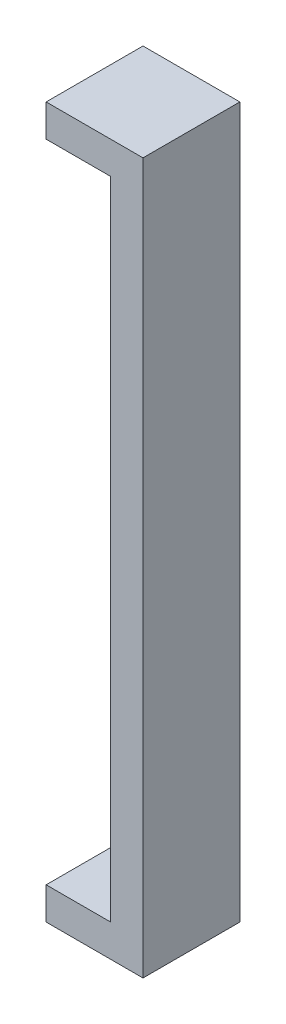
ISO-10303-21;
HEADER;
FILE_DESCRIPTION(('STEP AP214'),'2;1');
FILE_NAME('part.step','',(''),(''),'','','');
FILE_SCHEMA(('AUTOMOTIVE_DESIGN { 1 0 10303 214 1 1 1 1 }'));
ENDSEC;
DATA;
#1=APPLICATION_CONTEXT('core data for automotive mechanical design processes');
#2=APPLICATION_PROTOCOL_DEFINITION('international standard','automotive_design',2000,#1);
#3=PRODUCT_CONTEXT('',#1,'mechanical');
#4=PRODUCT('Part','Part','',(#3));
#5=PRODUCT_RELATED_PRODUCT_CATEGORY('part','',(#4));
#6=PRODUCT_DEFINITION_FORMATION('','',#4);
#7=PRODUCT_DEFINITION_CONTEXT('part definition',#1,'design');
#8=PRODUCT_DEFINITION('design','',#6,#7);
#9=PRODUCT_DEFINITION_SHAPE('','',#8);
#10=(LENGTH_UNIT() NAMED_UNIT(*) SI_UNIT(.MILLI.,.METRE.));
#11=(NAMED_UNIT(*) PLANE_ANGLE_UNIT() SI_UNIT($,.RADIAN.));
#12=(NAMED_UNIT(*) SI_UNIT($,.STERADIAN.) SOLID_ANGLE_UNIT());
#13=UNCERTAINTY_MEASURE_WITH_UNIT(LENGTH_MEASURE(1.E-05),#10,'distance_accuracy_value','');
#14=(GEOMETRIC_REPRESENTATION_CONTEXT(3) GLOBAL_UNCERTAINTY_ASSIGNED_CONTEXT((#13)) GLOBAL_UNIT_ASSIGNED_CONTEXT((#10,
#11,#12)) REPRESENTATION_CONTEXT('',''));
#15=CARTESIAN_POINT('',(0.,0.,0.));
#16=DIRECTION('',(0.,0.,1.));
#17=DIRECTION('',(1.,0.,0.));
#18=AXIS2_PLACEMENT_3D('',#15,#16,#17);
#19=CARTESIAN_POINT('',(2.94,33.,-3.20999999999999));
#20=DIRECTION('',(0.,0.,-1.));
#21=DIRECTION('',(-1.,0.,0.));
#22=AXIS2_PLACEMENT_3D('',#19,#20,#21);
#23=PLANE('',#22);
#24=DIRECTION('',(0.,-1.,0.));
#25=VECTOR('',#24,1.);
#26=CARTESIAN_POINT('',(-3.06,33.,-3.20999999999999));
#27=LINE('',#26,#25);
#28=CARTESIAN_POINT('',(-3.06,30.,-3.20999999999999));
#29=VERTEX_POINT('',#28);
#30=CARTESIAN_POINT('',(-3.06,-30.,-3.20999999999999));
#31=VERTEX_POINT('',#30);
#32=EDGE_CURVE('E11',#29,#31,#27,.T.);
#33=ORIENTED_EDGE('',*,*,#32,.T.);
#34=DIRECTION('',(1.,0.,0.));
#35=VECTOR('',#34,1.);
#36=CARTESIAN_POINT('',(-3.06,-30.,-3.20999999999999));
#37=LINE('',#36,#35);
#38=CARTESIAN_POINT('',(2.94,-30.,-3.20999999999999));
#39=VERTEX_POINT('',#38);
#40=EDGE_CURVE('E54',#31,#39,#37,.T.);
#41=ORIENTED_EDGE('',*,*,#40,.T.);
#42=DIRECTION('',(0.,-1.,0.));
#43=VECTOR('',#42,1.);
#44=CARTESIAN_POINT('',(2.94,33.,-3.20999999999999));
#45=LINE('',#44,#43);
#46=CARTESIAN_POINT('',(2.94,30.,-3.20999999999999));
#47=VERTEX_POINT('',#46);
#48=EDGE_CURVE('E48',#47,#39,#45,.T.);
#49=ORIENTED_EDGE('',*,*,#48,.F.);
#50=DIRECTION('',(1.,0.,0.));
#51=VECTOR('',#50,1.);
#52=CARTESIAN_POINT('',(-3.06,30.,-3.20999999999999));
#53=LINE('',#52,#51);
#54=EDGE_CURVE('E145',#29,#47,#53,.T.);
#55=ORIENTED_EDGE('',*,*,#54,.F.);
#56=EDGE_LOOP('',(#33,#41,#49,#55));
#57=FACE_BOUND('',#56,.T.);
#58=ADVANCED_FACE('F39',(#57),#23,.F.);
#59=CARTESIAN_POINT('',(2.94,33.,2.79000000000001));
#60=DIRECTION('',(1.,0.,0.));
#61=DIRECTION('',(0.,0.,-1.));
#62=AXIS2_PLACEMENT_3D('',#59,#60,#61);
#63=PLANE('',#62);
#64=ORIENTED_EDGE('',*,*,#48,.T.);
#65=DIRECTION('',(0.,0.,-1.));
#66=VECTOR('',#65,1.);
#67=CARTESIAN_POINT('',(2.94,-30.,2.79));
#68=LINE('',#67,#66);
#69=CARTESIAN_POINT('',(2.94,-30.,2.79000000000001));
#70=VERTEX_POINT('',#69);
#71=EDGE_CURVE('E141',#70,#39,#68,.T.);
#72=ORIENTED_EDGE('',*,*,#71,.F.);
#73=DIRECTION('',(0.,-1.,0.));
#74=VECTOR('',#73,1.);
#75=CARTESIAN_POINT('',(2.94,33.,2.79000000000001));
#76=LINE('',#75,#74);
#77=CARTESIAN_POINT('',(2.94,30.,2.79));
#78=VERTEX_POINT('',#77);
#79=EDGE_CURVE('E188',#78,#70,#76,.T.);
#80=ORIENTED_EDGE('',*,*,#79,.F.);
#81=DIRECTION('',(0.,0.,-1.));
#82=VECTOR('',#81,1.);
#83=CARTESIAN_POINT('',(2.94,30.,2.79));
#84=LINE('',#83,#82);
#85=EDGE_CURVE('E153',#78,#47,#84,.T.);
#86=ORIENTED_EDGE('',*,*,#85,.T.);
#87=EDGE_LOOP('',(#64,#72,#80,#86));
#88=FACE_BOUND('',#87,.T.);
#89=ADVANCED_FACE('F192',(#88),#63,.F.);
#90=CARTESIAN_POINT('',(-3.06,33.,-6.20999999999999));
#91=DIRECTION('',(1.,0.,0.));
#92=DIRECTION('',(0.,0.,-1.));
#93=AXIS2_PLACEMENT_3D('',#90,#91,#92);
#94=PLANE('',#93);
#95=DIRECTION('',(0.,0.,1.));
#96=VECTOR('',#95,1.);
#97=CARTESIAN_POINT('',(-3.06,-33.,-6.20999999999999));
#98=LINE('',#97,#96);
#99=CARTESIAN_POINT('',(-3.06,-33.,-6.20999999999999));
#100=VERTEX_POINT('',#99);
#101=CARTESIAN_POINT('',(-3.06,-33.,2.79));
#102=VERTEX_POINT('',#101);
#103=EDGE_CURVE('E108',#100,#102,#98,.T.);
#104=ORIENTED_EDGE('',*,*,#103,.T.);
#105=DIRECTION('',(0.,1.,0.));
#106=VECTOR('',#105,1.);
#107=CARTESIAN_POINT('',(-3.06,-33.,2.79));
#108=LINE('',#107,#106);
#109=CARTESIAN_POINT('',(-3.06,-30.,2.79));
#110=VERTEX_POINT('',#109);
#111=EDGE_CURVE('E119',#102,#110,#108,.T.);
#112=ORIENTED_EDGE('',*,*,#111,.T.);
#113=DIRECTION('',(0.,0.,-1.));
#114=VECTOR('',#113,1.);
#115=CARTESIAN_POINT('',(-3.06,-30.,2.79));
#116=LINE('',#115,#114);
#117=EDGE_CURVE('E135',#110,#31,#116,.T.);
#118=ORIENTED_EDGE('',*,*,#117,.T.);
#119=ORIENTED_EDGE('',*,*,#32,.F.);
#120=DIRECTION('',(0.,0.,-1.));
#121=VECTOR('',#120,1.);
#122=CARTESIAN_POINT('',(-3.06,30.,2.79));
#123=LINE('',#122,#121);
#124=CARTESIAN_POINT('',(-3.06,30.,2.79));
#125=VERTEX_POINT('',#124);
#126=EDGE_CURVE('E125',#125,#29,#123,.T.);
#127=ORIENTED_EDGE('',*,*,#126,.F.);
#128=DIRECTION('',(0.,-1.,0.));
#129=VECTOR('',#128,1.);
#130=CARTESIAN_POINT('',(-3.06,33.,2.79));
#131=LINE('',#130,#129);
#132=CARTESIAN_POINT('',(-3.06,33.,2.79));
#133=VERTEX_POINT('',#132);
#134=EDGE_CURVE('E146',#133,#125,#131,.T.);
#135=ORIENTED_EDGE('',*,*,#134,.F.);
#136=DIRECTION('',(0.,0.,1.));
#137=VECTOR('',#136,1.);
#138=CARTESIAN_POINT('',(-3.06,33.,-6.20999999999999));
#139=LINE('',#138,#137);
#140=CARTESIAN_POINT('',(-3.06,33.,-6.20999999999999));
#141=VERTEX_POINT('',#140);
#142=EDGE_CURVE('E161',#141,#133,#139,.T.);
#143=ORIENTED_EDGE('',*,*,#142,.F.);
#144=DIRECTION('',(0.,-1.,0.));
#145=VECTOR('',#144,1.);
#146=CARTESIAN_POINT('',(-3.06,33.,-6.20999999999999));
#147=LINE('',#146,#145);
#148=EDGE_CURVE('E123',#141,#100,#147,.T.);
#149=ORIENTED_EDGE('',*,*,#148,.T.);
#150=EDGE_LOOP('',(#104,#112,#118,#119,#127,#135,#143,#149));
#151=FACE_BOUND('',#150,.T.);
#152=ADVANCED_FACE('F41',(#151),#94,.F.);
#153=CARTESIAN_POINT('',(5.94,33.,2.79));
#154=DIRECTION('',(0.,0.,-1.));
#155=DIRECTION('',(-1.,0.,0.));
#156=AXIS2_PLACEMENT_3D('',#153,#154,#155);
#157=PLANE('',#156);
#158=DIRECTION('',(1.,0.,0.));
#159=VECTOR('',#158,1.);
#160=CARTESIAN_POINT('',(5.94,-33.,2.79));
#161=LINE('',#160,#159);
#162=CARTESIAN_POINT('',(5.94,-33.,2.79));
#163=VERTEX_POINT('',#162);
#164=EDGE_CURVE('E104',#102,#163,#161,.T.);
#165=ORIENTED_EDGE('',*,*,#164,.T.);
#166=DIRECTION('',(0.,-1.,0.));
#167=VECTOR('',#166,1.);
#168=CARTESIAN_POINT('',(5.94,33.,2.79));
#169=LINE('',#168,#167);
#170=CARTESIAN_POINT('',(5.94,33.,2.79));
#171=VERTEX_POINT('',#170);
#172=EDGE_CURVE('E185',#171,#163,#169,.T.);
#173=ORIENTED_EDGE('',*,*,#172,.F.);
#174=DIRECTION('',(1.,0.,0.));
#175=VECTOR('',#174,1.);
#176=CARTESIAN_POINT('',(5.94,33.,2.79));
#177=LINE('',#176,#175);
#178=EDGE_CURVE('E165',#133,#171,#177,.T.);
#179=ORIENTED_EDGE('',*,*,#178,.F.);
#180=ORIENTED_EDGE('',*,*,#134,.T.);
#181=DIRECTION('',(1.,0.,0.));
#182=VECTOR('',#181,1.);
#183=CARTESIAN_POINT('',(-3.06,30.,2.79));
#184=LINE('',#183,#182);
#185=EDGE_CURVE('E150',#125,#78,#184,.T.);
#186=ORIENTED_EDGE('',*,*,#185,.T.);
#187=ORIENTED_EDGE('',*,*,#79,.T.);
#188=DIRECTION('',(1.,0.,0.));
#189=VECTOR('',#188,1.);
#190=CARTESIAN_POINT('',(-3.06,-30.,2.79));
#191=LINE('',#190,#189);
#192=EDGE_CURVE('E130',#110,#70,#191,.T.);
#193=ORIENTED_EDGE('',*,*,#192,.F.);
#194=ORIENTED_EDGE('',*,*,#111,.F.);
#195=EDGE_LOOP('',(#165,#173,#179,#180,#186,#187,#193,#194));
#196=FACE_BOUND('',#195,.T.);
#197=ADVANCED_FACE('F127',(#196),#157,.F.);
#198=CARTESIAN_POINT('',(5.94,33.,-6.20999999999999));
#199=DIRECTION('',(-1.,0.,0.));
#200=DIRECTION('',(0.,0.,1.));
#201=AXIS2_PLACEMENT_3D('',#198,#199,#200);
#202=PLANE('',#201);
#203=DIRECTION('',(0.,0.,-1.));
#204=VECTOR('',#203,1.);
#205=CARTESIAN_POINT('',(5.94,-33.,-6.20999999999999));
#206=LINE('',#205,#204);
#207=CARTESIAN_POINT('',(5.94,-33.,-6.20999999999999));
#208=VERTEX_POINT('',#207);
#209=EDGE_CURVE('E109',#163,#208,#206,.T.);
#210=ORIENTED_EDGE('',*,*,#209,.T.);
#211=DIRECTION('',(0.,-1.,0.));
#212=VECTOR('',#211,1.);
#213=CARTESIAN_POINT('',(5.94,33.,-6.20999999999999));
#214=LINE('',#213,#212);
#215=CARTESIAN_POINT('',(5.94,33.,-6.20999999999999));
#216=VERTEX_POINT('',#215);
#217=EDGE_CURVE('E181',#216,#208,#214,.T.);
#218=ORIENTED_EDGE('',*,*,#217,.F.);
#219=DIRECTION('',(0.,0.,-1.));
#220=VECTOR('',#219,1.);
#221=CARTESIAN_POINT('',(5.94,33.,-6.20999999999999));
#222=LINE('',#221,#220);
#223=EDGE_CURVE('E169',#171,#216,#222,.T.);
#224=ORIENTED_EDGE('',*,*,#223,.F.);
#225=ORIENTED_EDGE('',*,*,#172,.T.);
#226=EDGE_LOOP('',(#210,#218,#224,#225));
#227=FACE_BOUND('',#226,.T.);
#228=ADVANCED_FACE('F210',(#227),#202,.F.);
#229=CARTESIAN_POINT('',(-3.06,33.,-6.20999999999999));
#230=DIRECTION('',(0.,0.,1.));
#231=DIRECTION('',(1.,0.,0.));
#232=AXIS2_PLACEMENT_3D('',#229,#230,#231);
#233=PLANE('',#232);
#234=DIRECTION('',(-1.,0.,0.));
#235=VECTOR('',#234,1.);
#236=CARTESIAN_POINT('',(-3.06,-33.,-6.20999999999999));
#237=LINE('',#236,#235);
#238=EDGE_CURVE('E166',#208,#100,#237,.T.);
#239=ORIENTED_EDGE('',*,*,#238,.T.);
#240=ORIENTED_EDGE('',*,*,#148,.F.);
#241=DIRECTION('',(-1.,0.,0.));
#242=VECTOR('',#241,1.);
#243=CARTESIAN_POINT('',(-3.06,33.,-6.20999999999999));
#244=LINE('',#243,#242);
#245=EDGE_CURVE('E172',#216,#141,#244,.T.);
#246=ORIENTED_EDGE('',*,*,#245,.F.);
#247=ORIENTED_EDGE('',*,*,#217,.T.);
#248=EDGE_LOOP('',(#239,#240,#246,#247));
#249=FACE_BOUND('',#248,.T.);
#250=ADVANCED_FACE('F213',(#249),#233,.F.);
#251=CARTESIAN_POINT('',(0.,33.,0.));
#252=DIRECTION('',(0.,-1.,0.));
#253=DIRECTION('',(0.,0.,-1.));
#254=AXIS2_PLACEMENT_3D('',#251,#252,#253);
#255=PLANE('',#254);
#256=ORIENTED_EDGE('',*,*,#142,.T.);
#257=ORIENTED_EDGE('',*,*,#178,.T.);
#258=ORIENTED_EDGE('',*,*,#223,.T.);
#259=ORIENTED_EDGE('',*,*,#245,.T.);
#260=EDGE_LOOP('',(#256,#257,#258,#259));
#261=FACE_BOUND('',#260,.T.);
#262=ADVANCED_FACE('F217',(#261),#255,.F.);
#263=CARTESIAN_POINT('',(0.,-33.,0.));
#264=DIRECTION('',(0.,-1.,0.));
#265=DIRECTION('',(0.,0.,-1.));
#266=AXIS2_PLACEMENT_3D('',#263,#264,#265);
#267=PLANE('',#266);
#268=ORIENTED_EDGE('',*,*,#164,.F.);
#269=ORIENTED_EDGE('',*,*,#103,.F.);
#270=ORIENTED_EDGE('',*,*,#238,.F.);
#271=ORIENTED_EDGE('',*,*,#209,.F.);
#272=EDGE_LOOP('',(#268,#269,#270,#271));
#273=FACE_BOUND('',#272,.T.);
#274=ADVANCED_FACE('F106',(#273),#267,.T.);
#275=CARTESIAN_POINT('',(-3.06,30.,2.79));
#276=DIRECTION('',(0.,1.,0.));
#277=DIRECTION('',(0.,0.,1.));
#278=AXIS2_PLACEMENT_3D('',#275,#276,#277);
#279=PLANE('',#278);
#280=ORIENTED_EDGE('',*,*,#54,.T.);
#281=ORIENTED_EDGE('',*,*,#85,.F.);
#282=ORIENTED_EDGE('',*,*,#185,.F.);
#283=ORIENTED_EDGE('',*,*,#126,.T.);
#284=EDGE_LOOP('',(#280,#281,#282,#283));
#285=FACE_BOUND('',#284,.T.);
#286=ADVANCED_FACE('F200',(#285),#279,.F.);
#287=CARTESIAN_POINT('',(-3.06,-30.,2.79));
#288=DIRECTION('',(0.,1.,0.));
#289=DIRECTION('',(0.,0.,1.));
#290=AXIS2_PLACEMENT_3D('',#287,#288,#289);
#291=PLANE('',#290);
#292=ORIENTED_EDGE('',*,*,#40,.F.);
#293=ORIENTED_EDGE('',*,*,#117,.F.);
#294=ORIENTED_EDGE('',*,*,#192,.T.);
#295=ORIENTED_EDGE('',*,*,#71,.T.);
#296=EDGE_LOOP('',(#292,#293,#294,#295));
#297=FACE_BOUND('',#296,.T.);
#298=ADVANCED_FACE('F196',(#297),#291,.T.);
#299=CLOSED_SHELL('',(#58,#89,#152,#197,#228,#250,#262,#274,#286,#298));
#300=MANIFOLD_SOLID_BREP('B2',#299);
#301=ADVANCED_BREP_SHAPE_REPRESENTATION('',(#18,#300),#14);
#302=SHAPE_DEFINITION_REPRESENTATION(#9,#301);
ENDSEC;
END-ISO-10303-21;
